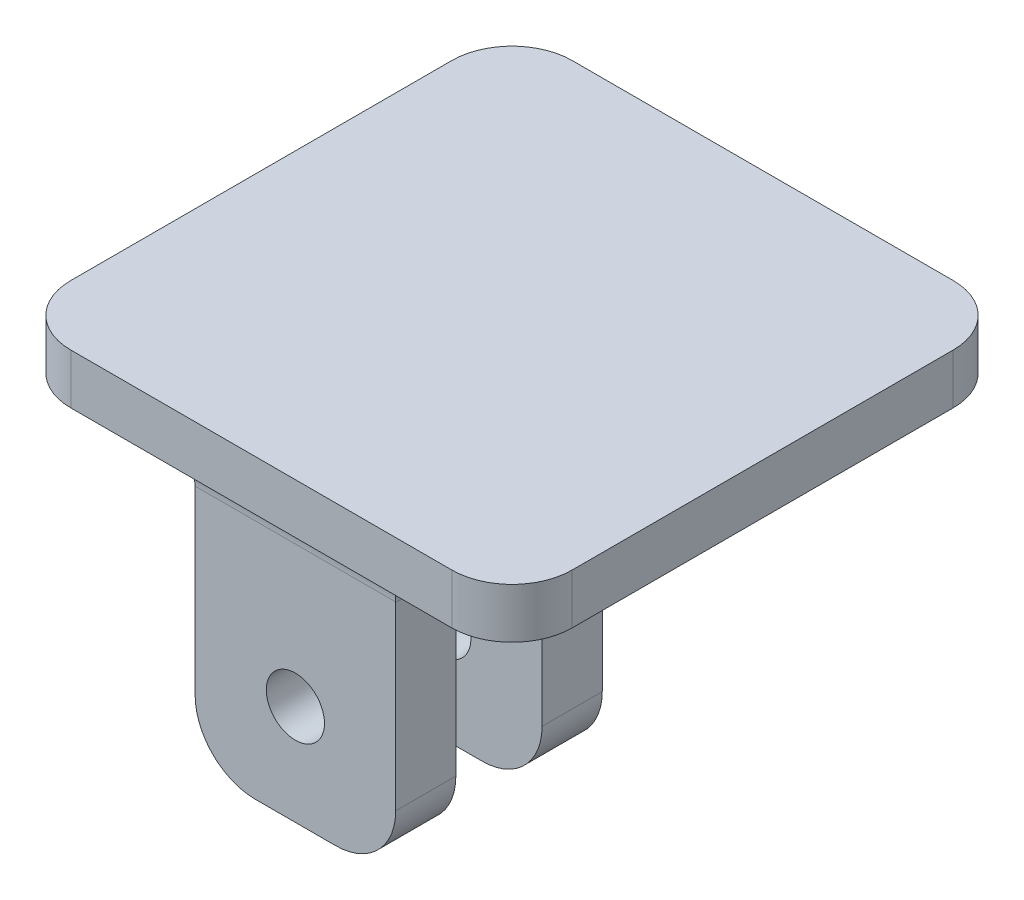
ISO-10303-21;
HEADER;
FILE_DESCRIPTION(('STEP AP214'),'2;1');
FILE_NAME('part.step','',(''),(''),'','','');
FILE_SCHEMA(('AUTOMOTIVE_DESIGN { 1 0 10303 214 1 1 1 1 }'));
ENDSEC;
DATA;
#1=APPLICATION_CONTEXT('core data for automotive mechanical design processes');
#2=APPLICATION_PROTOCOL_DEFINITION('international standard','automotive_design',2000,#1);
#3=PRODUCT_CONTEXT('',#1,'mechanical');
#4=PRODUCT('Part','Part','',(#3));
#5=PRODUCT_RELATED_PRODUCT_CATEGORY('part','',(#4));
#6=PRODUCT_DEFINITION_FORMATION('','',#4);
#7=PRODUCT_DEFINITION_CONTEXT('part definition',#1,'design');
#8=PRODUCT_DEFINITION('design','',#6,#7);
#9=PRODUCT_DEFINITION_SHAPE('','',#8);
#10=(LENGTH_UNIT() NAMED_UNIT(*) SI_UNIT(.MILLI.,.METRE.));
#11=(NAMED_UNIT(*) PLANE_ANGLE_UNIT() SI_UNIT($,.RADIAN.));
#12=(NAMED_UNIT(*) SI_UNIT($,.STERADIAN.) SOLID_ANGLE_UNIT());
#13=UNCERTAINTY_MEASURE_WITH_UNIT(LENGTH_MEASURE(1.E-05),#10,'distance_accuracy_value','');
#14=(GEOMETRIC_REPRESENTATION_CONTEXT(3) GLOBAL_UNCERTAINTY_ASSIGNED_CONTEXT((#13)) GLOBAL_UNIT_ASSIGNED_CONTEXT((#10,
#11,#12)) REPRESENTATION_CONTEXT('',''));
#15=CARTESIAN_POINT('',(0.,0.,0.));
#16=DIRECTION('',(0.,0.,1.));
#17=DIRECTION('',(1.,0.,0.));
#18=AXIS2_PLACEMENT_3D('',#15,#16,#17);
#19=CARTESIAN_POINT('',(-7.5,-14.,-1.7));
#20=DIRECTION('',(-1.,0.,0.));
#21=DIRECTION('',(0.,0.,1.));
#22=AXIS2_PLACEMENT_3D('',#19,#20,#21);
#23=PLANE('',#22);
#24=DIRECTION('',(0.,1.,0.));
#25=VECTOR('',#24,1.);
#26=CARTESIAN_POINT('',(-7.5,-14.,-12.));
#27=LINE('',#26,#25);
#28=CARTESIAN_POINT('',(-7.5,-11.,-12.));
#29=VERTEX_POINT('',#28);
#30=CARTESIAN_POINT('',(-7.5,-2.,-12.));
#31=VERTEX_POINT('',#30);
#32=EDGE_CURVE('E411',#29,#31,#27,.T.);
#33=ORIENTED_EDGE('',*,*,#32,.T.);
#34=DIRECTION('',(0.,0.,1.));
#35=VECTOR('',#34,1.);
#36=CARTESIAN_POINT('',(-7.5,-2.,-1.7));
#37=LINE('',#36,#35);
#38=CARTESIAN_POINT('',(-7.5,-2.,-9.));
#39=VERTEX_POINT('',#38);
#40=EDGE_CURVE('E256',#31,#39,#37,.T.);
#41=ORIENTED_EDGE('',*,*,#40,.T.);
#42=DIRECTION('',(0.,-1.,0.));
#43=VECTOR('',#42,1.);
#44=CARTESIAN_POINT('',(-7.5,-2.,-9.));
#45=LINE('',#44,#43);
#46=CARTESIAN_POINT('',(-7.5,-11.,-9.));
#47=VERTEX_POINT('',#46);
#48=EDGE_CURVE('E207',#39,#47,#45,.T.);
#49=ORIENTED_EDGE('',*,*,#48,.T.);
#50=DIRECTION('',(0.,0.,1.));
#51=VECTOR('',#50,1.);
#52=CARTESIAN_POINT('',(-7.5,-11.,-12.));
#53=LINE('',#52,#51);
#54=EDGE_CURVE('E461',#47,#29,#53,.F.);
#55=ORIENTED_EDGE('',*,*,#54,.T.);
#56=EDGE_LOOP('',(#33,#41,#49,#55));
#57=FACE_BOUND('',#56,.T.);
#58=ADVANCED_FACE('F33',(#57),#23,.F.);
#59=CARTESIAN_POINT('',(-17.5,-14.,-1.7));
#60=DIRECTION('',(1.,0.,0.));
#61=DIRECTION('',(0.,0.,-1.));
#62=AXIS2_PLACEMENT_3D('',#59,#60,#61);
#63=PLANE('',#62);
#64=DIRECTION('',(0.,1.,0.));
#65=VECTOR('',#64,1.);
#66=CARTESIAN_POINT('',(-17.5,-14.,-1.7));
#67=LINE('',#66,#65);
#68=CARTESIAN_POINT('',(-17.5,-11.,-1.7));
#69=VERTEX_POINT('',#68);
#70=CARTESIAN_POINT('',(-17.5,-2.,-1.7));
#71=VERTEX_POINT('',#70);
#72=EDGE_CURVE('E406',#69,#71,#67,.T.);
#73=ORIENTED_EDGE('',*,*,#72,.T.);
#74=DIRECTION('',(0.,0.,-1.));
#75=VECTOR('',#74,1.);
#76=CARTESIAN_POINT('',(-17.5,-2.,-12.));
#77=LINE('',#76,#75);
#78=CARTESIAN_POINT('',(-17.5,-2.,-4.7));
#79=VERTEX_POINT('',#78);
#80=EDGE_CURVE('E236',#71,#79,#77,.T.);
#81=ORIENTED_EDGE('',*,*,#80,.T.);
#82=DIRECTION('',(0.,-1.,0.));
#83=VECTOR('',#82,1.);
#84=CARTESIAN_POINT('',(-17.5,-2.,-4.7));
#85=LINE('',#84,#83);
#86=CARTESIAN_POINT('',(-17.5,-11.,-4.7));
#87=VERTEX_POINT('',#86);
#88=EDGE_CURVE('E393',#79,#87,#85,.T.);
#89=ORIENTED_EDGE('',*,*,#88,.T.);
#90=DIRECTION('',(0.,0.,-1.));
#91=VECTOR('',#90,1.);
#92=CARTESIAN_POINT('',(-17.5,-11.,-1.7));
#93=LINE('',#92,#91);
#94=EDGE_CURVE('E452',#87,#69,#93,.F.);
#95=ORIENTED_EDGE('',*,*,#94,.T.);
#96=EDGE_LOOP('',(#73,#81,#89,#95));
#97=FACE_BOUND('',#96,.T.);
#98=ADVANCED_FACE('F291',(#97),#63,.F.);
#99=CARTESIAN_POINT('',(0.,-14.,0.));
#100=DIRECTION('',(0.,-1.,0.));
#101=DIRECTION('',(0.,0.,-1.));
#102=AXIS2_PLACEMENT_3D('',#99,#100,#101);
#103=PLANE('',#102);
#104=DIRECTION('',(-1.,0.,0.));
#105=VECTOR('',#104,1.);
#106=CARTESIAN_POINT('',(-17.5,-14.,-4.7));
#107=LINE('',#106,#105);
#108=CARTESIAN_POINT('',(-10.5,-14.,-4.7));
#109=VERTEX_POINT('',#108);
#110=CARTESIAN_POINT('',(-14.5,-14.,-4.7));
#111=VERTEX_POINT('',#110);
#112=EDGE_CURVE('E221',#109,#111,#107,.T.);
#113=ORIENTED_EDGE('',*,*,#112,.F.);
#114=DIRECTION('',(0.,0.,1.));
#115=VECTOR('',#114,1.);
#116=CARTESIAN_POINT('',(-10.5,-14.,-1.7));
#117=LINE('',#116,#115);
#118=CARTESIAN_POINT('',(-10.5,-14.,-1.7));
#119=VERTEX_POINT('',#118);
#120=EDGE_CURVE('E466',#109,#119,#117,.T.);
#121=ORIENTED_EDGE('',*,*,#120,.T.);
#122=DIRECTION('',(-1.,0.,0.));
#123=VECTOR('',#122,1.);
#124=CARTESIAN_POINT('',(-17.5,-14.,-1.7));
#125=LINE('',#124,#123);
#126=CARTESIAN_POINT('',(-14.5,-14.,-1.7));
#127=VERTEX_POINT('',#126);
#128=EDGE_CURVE('E403',#119,#127,#125,.T.);
#129=ORIENTED_EDGE('',*,*,#128,.T.);
#130=DIRECTION('',(0.,0.,-1.));
#131=VECTOR('',#130,1.);
#132=CARTESIAN_POINT('',(-14.5,-14.,-4.7));
#133=LINE('',#132,#131);
#134=EDGE_CURVE('E463',#127,#111,#133,.T.);
#135=ORIENTED_EDGE('',*,*,#134,.T.);
#136=EDGE_LOOP('',(#113,#121,#129,#135));
#137=FACE_BOUND('',#136,.T.);
#138=ADVANCED_FACE('F300',(#137),#103,.T.);
#139=CARTESIAN_POINT('',(0.,0.,0.));
#140=DIRECTION('',(0.,1.,0.));
#141=DIRECTION('',(0.,0.,1.));
#142=AXIS2_PLACEMENT_3D('',#139,#140,#141);
#143=PLANE('',#142);
#144=DIRECTION('',(1.,0.,0.));
#145=VECTOR('',#144,1.);
#146=CARTESIAN_POINT('',(-17.5,0.,-14.));
#147=LINE('',#146,#145);
#148=CARTESIAN_POINT('',(-5.5,0.,-14.));
#149=VERTEX_POINT('',#148);
#150=CARTESIAN_POINT('',(-19.5,0.,-14.));
#151=VERTEX_POINT('',#150);
#152=EDGE_CURVE('E239',#149,#151,#147,.F.);
#153=ORIENTED_EDGE('',*,*,#152,.T.);
#154=DIRECTION('',(0.,0.,-1.));
#155=VECTOR('',#154,1.);
#156=CARTESIAN_POINT('',(-19.5,0.,-1.7));
#157=LINE('',#156,#155);
#158=CARTESIAN_POINT('',(-19.5,0.,0.));
#159=VERTEX_POINT('',#158);
#160=EDGE_CURVE('E249',#151,#159,#157,.F.);
#161=ORIENTED_EDGE('',*,*,#160,.T.);
#162=DIRECTION('',(1.,0.,0.));
#163=VECTOR('',#162,1.);
#164=CARTESIAN_POINT('',(0.,0.,0.));
#165=LINE('',#164,#163);
#166=CARTESIAN_POINT('',(-22.,0.,0.));
#167=VERTEX_POINT('',#166);
#168=EDGE_CURVE('E421',#167,#159,#165,.T.);
#169=ORIENTED_EDGE('',*,*,#168,.F.);
#170=CARTESIAN_POINT('',(-22.,0.,-3.));
#171=DIRECTION('',(0.,1.,0.));
#172=DIRECTION('',(0.,0.,1.));
#173=AXIS2_PLACEMENT_3D('',#170,#171,#172);
#174=CIRCLE('',#173,3.);
#175=CARTESIAN_POINT('',(-25.,0.,-3.));
#176=VERTEX_POINT('',#175);
#177=EDGE_CURVE('E486',#167,#176,#174,.F.);
#178=ORIENTED_EDGE('',*,*,#177,.T.);
#179=DIRECTION('',(0.,0.,1.));
#180=VECTOR('',#179,1.);
#181=CARTESIAN_POINT('',(-25.,0.,0.));
#182=LINE('',#181,#180);
#183=CARTESIAN_POINT('',(-25.,0.,-22.));
#184=VERTEX_POINT('',#183);
#185=EDGE_CURVE('E436',#184,#176,#182,.T.);
#186=ORIENTED_EDGE('',*,*,#185,.F.);
#187=CARTESIAN_POINT('',(-22.,0.,-22.));
#188=DIRECTION('',(0.,1.,0.));
#189=DIRECTION('',(0.,0.,1.));
#190=AXIS2_PLACEMENT_3D('',#187,#188,#189);
#191=CIRCLE('',#190,3.);
#192=CARTESIAN_POINT('',(-22.,0.,-25.));
#193=VERTEX_POINT('',#192);
#194=EDGE_CURVE('E482',#184,#193,#191,.F.);
#195=ORIENTED_EDGE('',*,*,#194,.T.);
#196=DIRECTION('',(-1.,0.,0.));
#197=VECTOR('',#196,1.);
#198=CARTESIAN_POINT('',(0.,0.,-25.));
#199=LINE('',#198,#197);
#200=CARTESIAN_POINT('',(-3.,0.,-25.));
#201=VERTEX_POINT('',#200);
#202=EDGE_CURVE('E433',#201,#193,#199,.T.);
#203=ORIENTED_EDGE('',*,*,#202,.F.);
#204=CARTESIAN_POINT('',(-3.,0.,-22.));
#205=DIRECTION('',(0.,1.,0.));
#206=DIRECTION('',(0.,0.,1.));
#207=AXIS2_PLACEMENT_3D('',#204,#205,#206);
#208=CIRCLE('',#207,3.);
#209=CARTESIAN_POINT('',(0.,0.,-22.));
#210=VERTEX_POINT('',#209);
#211=EDGE_CURVE('E484',#201,#210,#208,.F.);
#212=ORIENTED_EDGE('',*,*,#211,.T.);
#213=DIRECTION('',(0.,0.,-1.));
#214=VECTOR('',#213,1.);
#215=CARTESIAN_POINT('',(0.,0.,0.));
#216=LINE('',#215,#214);
#217=CARTESIAN_POINT('',(0.,0.,-3.));
#218=VERTEX_POINT('',#217);
#219=EDGE_CURVE('E416',#218,#210,#216,.T.);
#220=ORIENTED_EDGE('',*,*,#219,.F.);
#221=CARTESIAN_POINT('',(-3.,0.,-3.));
#222=DIRECTION('',(0.,1.,0.));
#223=DIRECTION('',(0.,0.,1.));
#224=AXIS2_PLACEMENT_3D('',#221,#222,#223);
#225=CIRCLE('',#224,3.);
#226=CARTESIAN_POINT('',(-3.,0.,0.));
#227=VERTEX_POINT('',#226);
#228=EDGE_CURVE('E488',#218,#227,#225,.F.);
#229=ORIENTED_EDGE('',*,*,#228,.T.);
#230=CARTESIAN_POINT('',(-5.5,0.,0.));
#231=VERTEX_POINT('',#230);
#232=EDGE_CURVE('E439',#231,#227,#165,.T.);
#233=ORIENTED_EDGE('',*,*,#232,.F.);
#234=DIRECTION('',(0.,0.,1.));
#235=VECTOR('',#234,1.);
#236=CARTESIAN_POINT('',(-5.5,0.,-12.));
#237=LINE('',#236,#235);
#238=EDGE_CURVE('E247',#231,#149,#237,.F.);
#239=ORIENTED_EDGE('',*,*,#238,.T.);
#240=EDGE_LOOP('',(#153,#161,#169,#178,#186,#195,#203,#212,#220,#229,#233,#239));
#241=FACE_BOUND('',#240,.T.);
#242=ADVANCED_FACE('F296',(#241),#143,.F.);
#243=CARTESIAN_POINT('',(0.,2.5,0.));
#244=DIRECTION('',(-1.,0.,0.));
#245=DIRECTION('',(0.,0.,1.));
#246=AXIS2_PLACEMENT_3D('',#243,#244,#245);
#247=PLANE('',#246);
#248=DIRECTION('',(0.,0.,-1.));
#249=VECTOR('',#248,1.);
#250=CARTESIAN_POINT('',(0.,2.5,0.));
#251=LINE('',#250,#249);
#252=CARTESIAN_POINT('',(0.,2.5,-3.));
#253=VERTEX_POINT('',#252);
#254=CARTESIAN_POINT('',(0.,2.5,-22.));
#255=VERTEX_POINT('',#254);
#256=EDGE_CURVE('E417',#253,#255,#251,.T.);
#257=ORIENTED_EDGE('',*,*,#256,.F.);
#258=DIRECTION('',(0.,-1.,0.));
#259=VECTOR('',#258,1.);
#260=CARTESIAN_POINT('',(0.,2.5,-3.));
#261=LINE('',#260,#259);
#262=EDGE_CURVE('E479',#253,#218,#261,.T.);
#263=ORIENTED_EDGE('',*,*,#262,.T.);
#264=ORIENTED_EDGE('',*,*,#219,.T.);
#265=DIRECTION('',(0.,-1.,0.));
#266=VECTOR('',#265,1.);
#267=CARTESIAN_POINT('',(0.,2.5,-22.));
#268=LINE('',#267,#266);
#269=EDGE_CURVE('E477',#210,#255,#268,.F.);
#270=ORIENTED_EDGE('',*,*,#269,.T.);
#271=EDGE_LOOP('',(#257,#263,#264,#270));
#272=FACE_BOUND('',#271,.T.);
#273=ADVANCED_FACE('F299',(#272),#247,.F.);
#274=CARTESIAN_POINT('',(0.,2.5,-25.));
#275=DIRECTION('',(0.,0.,1.));
#276=DIRECTION('',(1.,0.,0.));
#277=AXIS2_PLACEMENT_3D('',#274,#275,#276);
#278=PLANE('',#277);
#279=DIRECTION('',(-1.,0.,0.));
#280=VECTOR('',#279,1.);
#281=CARTESIAN_POINT('',(0.,2.5,-25.));
#282=LINE('',#281,#280);
#283=CARTESIAN_POINT('',(-3.,2.5,-25.));
#284=VERTEX_POINT('',#283);
#285=CARTESIAN_POINT('',(-22.,2.5,-25.));
#286=VERTEX_POINT('',#285);
#287=EDGE_CURVE('E420',#284,#286,#282,.T.);
#288=ORIENTED_EDGE('',*,*,#287,.F.);
#289=DIRECTION('',(0.,-1.,0.));
#290=VECTOR('',#289,1.);
#291=CARTESIAN_POINT('',(-3.,2.5,-25.));
#292=LINE('',#291,#290);
#293=EDGE_CURVE('E237',#284,#201,#292,.T.);
#294=ORIENTED_EDGE('',*,*,#293,.T.);
#295=ORIENTED_EDGE('',*,*,#202,.T.);
#296=DIRECTION('',(0.,-1.,0.));
#297=VECTOR('',#296,1.);
#298=CARTESIAN_POINT('',(-22.,2.5,-25.));
#299=LINE('',#298,#297);
#300=EDGE_CURVE('E242',#193,#286,#299,.F.);
#301=ORIENTED_EDGE('',*,*,#300,.T.);
#302=EDGE_LOOP('',(#288,#294,#295,#301));
#303=FACE_BOUND('',#302,.T.);
#304=ADVANCED_FACE('F308',(#303),#278,.F.);
#305=CARTESIAN_POINT('',(-25.,2.5,0.));
#306=DIRECTION('',(1.,0.,0.));
#307=DIRECTION('',(0.,0.,-1.));
#308=AXIS2_PLACEMENT_3D('',#305,#306,#307);
#309=PLANE('',#308);
#310=ORIENTED_EDGE('',*,*,#185,.T.);
#311=DIRECTION('',(0.,-1.,0.));
#312=VECTOR('',#311,1.);
#313=CARTESIAN_POINT('',(-25.,2.5,-3.));
#314=LINE('',#313,#312);
#315=CARTESIAN_POINT('',(-25.,2.5,-3.));
#316=VERTEX_POINT('',#315);
#317=EDGE_CURVE('E507',#176,#316,#314,.F.);
#318=ORIENTED_EDGE('',*,*,#317,.T.);
#319=DIRECTION('',(0.,0.,1.));
#320=VECTOR('',#319,1.);
#321=CARTESIAN_POINT('',(-25.,2.5,0.));
#322=LINE('',#321,#320);
#323=CARTESIAN_POINT('',(-25.,2.5,-22.));
#324=VERTEX_POINT('',#323);
#325=EDGE_CURVE('E424',#324,#316,#322,.T.);
#326=ORIENTED_EDGE('',*,*,#325,.F.);
#327=DIRECTION('',(0.,-1.,0.));
#328=VECTOR('',#327,1.);
#329=CARTESIAN_POINT('',(-25.,2.5,-22.));
#330=LINE('',#329,#328);
#331=EDGE_CURVE('E504',#324,#184,#330,.T.);
#332=ORIENTED_EDGE('',*,*,#331,.T.);
#333=EDGE_LOOP('',(#310,#318,#326,#332));
#334=FACE_BOUND('',#333,.T.);
#335=ADVANCED_FACE('F304',(#334),#309,.F.);
#336=CARTESIAN_POINT('',(0.,2.5,0.));
#337=DIRECTION('',(0.,0.,-1.));
#338=DIRECTION('',(-1.,0.,0.));
#339=AXIS2_PLACEMENT_3D('',#336,#337,#338);
#340=PLANE('',#339);
#341=ORIENTED_EDGE('',*,*,#168,.T.);
#342=EDGE_CURVE('E441',#159,#231,#165,.T.);
#343=ORIENTED_EDGE('',*,*,#342,.T.);
#344=ORIENTED_EDGE('',*,*,#232,.T.);
#345=DIRECTION('',(0.,-1.,0.));
#346=VECTOR('',#345,1.);
#347=CARTESIAN_POINT('',(-3.,2.5,0.));
#348=LINE('',#347,#346);
#349=CARTESIAN_POINT('',(-3.,2.5,0.));
#350=VERTEX_POINT('',#349);
#351=EDGE_CURVE('E494',#227,#350,#348,.F.);
#352=ORIENTED_EDGE('',*,*,#351,.T.);
#353=DIRECTION('',(1.,0.,0.));
#354=VECTOR('',#353,1.);
#355=CARTESIAN_POINT('',(0.,2.5,0.));
#356=LINE('',#355,#354);
#357=CARTESIAN_POINT('',(-22.,2.5,0.));
#358=VERTEX_POINT('',#357);
#359=EDGE_CURVE('E427',#358,#350,#356,.T.);
#360=ORIENTED_EDGE('',*,*,#359,.F.);
#361=DIRECTION('',(0.,-1.,0.));
#362=VECTOR('',#361,1.);
#363=CARTESIAN_POINT('',(-22.,2.5,0.));
#364=LINE('',#363,#362);
#365=EDGE_CURVE('E491',#358,#167,#364,.T.);
#366=ORIENTED_EDGE('',*,*,#365,.T.);
#367=EDGE_LOOP('',(#341,#343,#344,#352,#360,#366));
#368=FACE_BOUND('',#367,.T.);
#369=ADVANCED_FACE('F294',(#368),#340,.F.);
#370=CARTESIAN_POINT('',(0.,2.5,0.));
#371=DIRECTION('',(0.,1.,0.));
#372=DIRECTION('',(0.,0.,1.));
#373=AXIS2_PLACEMENT_3D('',#370,#371,#372);
#374=PLANE('',#373);
#375=ORIENTED_EDGE('',*,*,#359,.T.);
#376=CARTESIAN_POINT('',(-3.,2.5,-3.));
#377=DIRECTION('',(0.,1.,0.));
#378=DIRECTION('',(0.,0.,1.));
#379=AXIS2_PLACEMENT_3D('',#376,#377,#378);
#380=CIRCLE('',#379,3.);
#381=EDGE_CURVE('E502',#350,#253,#380,.T.);
#382=ORIENTED_EDGE('',*,*,#381,.T.);
#383=ORIENTED_EDGE('',*,*,#256,.T.);
#384=CARTESIAN_POINT('',(-3.,2.5,-22.));
#385=DIRECTION('',(0.,1.,0.));
#386=DIRECTION('',(0.,0.,1.));
#387=AXIS2_PLACEMENT_3D('',#384,#385,#386);
#388=CIRCLE('',#387,3.);
#389=EDGE_CURVE('E498',#255,#284,#388,.T.);
#390=ORIENTED_EDGE('',*,*,#389,.T.);
#391=ORIENTED_EDGE('',*,*,#287,.T.);
#392=CARTESIAN_POINT('',(-22.,2.5,-22.));
#393=DIRECTION('',(0.,1.,0.));
#394=DIRECTION('',(0.,0.,1.));
#395=AXIS2_PLACEMENT_3D('',#392,#393,#394);
#396=CIRCLE('',#395,3.);
#397=EDGE_CURVE('E496',#286,#324,#396,.T.);
#398=ORIENTED_EDGE('',*,*,#397,.T.);
#399=ORIENTED_EDGE('',*,*,#325,.T.);
#400=CARTESIAN_POINT('',(-22.,2.5,-3.));
#401=DIRECTION('',(0.,1.,0.));
#402=DIRECTION('',(0.,0.,1.));
#403=AXIS2_PLACEMENT_3D('',#400,#401,#402);
#404=CIRCLE('',#403,3.);
#405=EDGE_CURVE('E500',#316,#358,#404,.T.);
#406=ORIENTED_EDGE('',*,*,#405,.T.);
#407=EDGE_LOOP('',(#375,#382,#383,#390,#391,#398,#399,#406));
#408=FACE_BOUND('',#407,.T.);
#409=ADVANCED_FACE('F290',(#408),#374,.T.);
#410=DIRECTION('',(0.,-1.,0.));
#411=VECTOR('',#410,1.);
#412=CARTESIAN_POINT('',(-17.5,-2.,-9.));
#413=LINE('',#412,#411);
#414=CARTESIAN_POINT('',(-17.5,-2.,-9.));
#415=VERTEX_POINT('',#414);
#416=CARTESIAN_POINT('',(-17.5,-11.,-9.));
#417=VERTEX_POINT('',#416);
#418=EDGE_CURVE('E204',#415,#417,#413,.T.);
#419=ORIENTED_EDGE('',*,*,#418,.F.);
#420=DIRECTION('',(0.,0.,-1.));
#421=VECTOR('',#420,1.);
#422=CARTESIAN_POINT('',(-17.5,-2.,-12.));
#423=LINE('',#422,#421);
#424=CARTESIAN_POINT('',(-17.5,-2.,-12.));
#425=VERTEX_POINT('',#424);
#426=EDGE_CURVE('E226',#415,#425,#423,.T.);
#427=ORIENTED_EDGE('',*,*,#426,.T.);
#428=DIRECTION('',(0.,1.,0.));
#429=VECTOR('',#428,1.);
#430=CARTESIAN_POINT('',(-17.5,-14.,-12.));
#431=LINE('',#430,#429);
#432=CARTESIAN_POINT('',(-17.5,-11.,-12.));
#433=VERTEX_POINT('',#432);
#434=EDGE_CURVE('E414',#433,#425,#431,.T.);
#435=ORIENTED_EDGE('',*,*,#434,.F.);
#436=DIRECTION('',(0.,0.,-1.));
#437=VECTOR('',#436,1.);
#438=CARTESIAN_POINT('',(-17.5,-11.,-9.));
#439=LINE('',#438,#437);
#440=EDGE_CURVE('E229',#433,#417,#439,.F.);
#441=ORIENTED_EDGE('',*,*,#440,.T.);
#442=EDGE_LOOP('',(#419,#427,#435,#441));
#443=FACE_BOUND('',#442,.T.);
#444=ADVANCED_FACE('F224',(#443),#63,.F.);
#445=CARTESIAN_POINT('',(-17.5,-14.,-12.));
#446=DIRECTION('',(0.,0.,1.));
#447=DIRECTION('',(1.,0.,0.));
#448=AXIS2_PLACEMENT_3D('',#445,#446,#447);
#449=PLANE('',#448);
#450=CARTESIAN_POINT('',(-12.5,-9.,-12.));
#451=DIRECTION('',(0.,0.,1.));
#452=DIRECTION('',(1.,0.,0.));
#453=AXIS2_PLACEMENT_3D('',#450,#451,#452);
#454=CIRCLE('',#453,1.45);
#455=CARTESIAN_POINT('',(-11.05,-9.,-12.));
#456=VERTEX_POINT('',#455);
#457=EDGE_CURVE('E383',#456,#456,#454,.T.);
#458=ORIENTED_EDGE('',*,*,#457,.T.);
#459=EDGE_LOOP('',(#458));
#460=FACE_BOUND('',#459,.T.);
#461=ORIENTED_EDGE('',*,*,#434,.T.);
#462=DIRECTION('',(1.,0.,0.));
#463=VECTOR('',#462,1.);
#464=CARTESIAN_POINT('',(-7.5,-2.,-12.));
#465=LINE('',#464,#463);
#466=EDGE_CURVE('E258',#425,#31,#465,.T.);
#467=ORIENTED_EDGE('',*,*,#466,.T.);
#468=ORIENTED_EDGE('',*,*,#32,.F.);
#469=CARTESIAN_POINT('',(-10.5,-11.,-12.));
#470=DIRECTION('',(0.,0.,1.));
#471=DIRECTION('',(1.,0.,0.));
#472=AXIS2_PLACEMENT_3D('',#469,#470,#471);
#473=CIRCLE('',#472,3.);
#474=CARTESIAN_POINT('',(-10.5,-14.,-12.));
#475=VERTEX_POINT('',#474);
#476=EDGE_CURVE('E448',#29,#475,#473,.F.);
#477=ORIENTED_EDGE('',*,*,#476,.T.);
#478=DIRECTION('',(1.,0.,0.));
#479=VECTOR('',#478,1.);
#480=CARTESIAN_POINT('',(-17.5,-14.,-12.));
#481=LINE('',#480,#479);
#482=CARTESIAN_POINT('',(-14.5,-14.,-12.));
#483=VERTEX_POINT('',#482);
#484=EDGE_CURVE('E396',#483,#475,#481,.T.);
#485=ORIENTED_EDGE('',*,*,#484,.F.);
#486=CARTESIAN_POINT('',(-14.5,-11.,-12.));
#487=DIRECTION('',(0.,0.,1.));
#488=DIRECTION('',(1.,0.,0.));
#489=AXIS2_PLACEMENT_3D('',#486,#487,#488);
#490=CIRCLE('',#489,3.);
#491=EDGE_CURVE('E450',#483,#433,#490,.F.);
#492=ORIENTED_EDGE('',*,*,#491,.T.);
#493=EDGE_LOOP('',(#461,#467,#468,#477,#485,#492));
#494=FACE_BOUND('',#493,.T.);
#495=ADVANCED_FACE('F283',(#460,#494),#449,.F.);
#496=DIRECTION('',(0.,-1.,0.));
#497=VECTOR('',#496,1.);
#498=CARTESIAN_POINT('',(-7.5,-2.,-4.7));
#499=LINE('',#498,#497);
#500=CARTESIAN_POINT('',(-7.5,-2.,-4.7));
#501=VERTEX_POINT('',#500);
#502=CARTESIAN_POINT('',(-7.5,-11.,-4.7));
#503=VERTEX_POINT('',#502);
#504=EDGE_CURVE('E397',#501,#503,#499,.T.);
#505=ORIENTED_EDGE('',*,*,#504,.F.);
#506=DIRECTION('',(0.,0.,1.));
#507=VECTOR('',#506,1.);
#508=CARTESIAN_POINT('',(-7.5,-2.,-1.7));
#509=LINE('',#508,#507);
#510=CARTESIAN_POINT('',(-7.5,-2.,-1.7));
#511=VERTEX_POINT('',#510);
#512=EDGE_CURVE('E254',#501,#511,#509,.T.);
#513=ORIENTED_EDGE('',*,*,#512,.T.);
#514=DIRECTION('',(0.,1.,0.));
#515=VECTOR('',#514,1.);
#516=CARTESIAN_POINT('',(-7.5,-14.,-1.7));
#517=LINE('',#516,#515);
#518=CARTESIAN_POINT('',(-7.5,-11.,-1.7));
#519=VERTEX_POINT('',#518);
#520=EDGE_CURVE('E409',#519,#511,#517,.T.);
#521=ORIENTED_EDGE('',*,*,#520,.F.);
#522=DIRECTION('',(0.,0.,1.));
#523=VECTOR('',#522,1.);
#524=CARTESIAN_POINT('',(-7.5,-11.,-4.7));
#525=LINE('',#524,#523);
#526=EDGE_CURVE('E459',#519,#503,#525,.F.);
#527=ORIENTED_EDGE('',*,*,#526,.T.);
#528=EDGE_LOOP('',(#505,#513,#521,#527));
#529=FACE_BOUND('',#528,.T.);
#530=ADVANCED_FACE('F277',(#529),#23,.F.);
#531=CARTESIAN_POINT('',(-17.5,-14.,-1.7));
#532=DIRECTION('',(0.,0.,-1.));
#533=DIRECTION('',(-1.,0.,0.));
#534=AXIS2_PLACEMENT_3D('',#531,#532,#533);
#535=PLANE('',#534);
#536=CARTESIAN_POINT('',(-12.5,-9.,-1.7));
#537=DIRECTION('',(0.,0.,1.));
#538=DIRECTION('',(1.,0.,0.));
#539=AXIS2_PLACEMENT_3D('',#536,#537,#538);
#540=CIRCLE('',#539,1.45);
#541=CARTESIAN_POINT('',(-11.05,-9.,-1.7));
#542=VERTEX_POINT('',#541);
#543=EDGE_CURVE('E369',#542,#542,#540,.T.);
#544=ORIENTED_EDGE('',*,*,#543,.F.);
#545=EDGE_LOOP('',(#544));
#546=FACE_BOUND('',#545,.T.);
#547=ORIENTED_EDGE('',*,*,#520,.T.);
#548=CARTESIAN_POINT('',(-5.5,-2.,-1.7));
#549=DIRECTION('',(0.,0.,-1.));
#550=DIRECTION('',(-1.,0.,0.));
#551=AXIS2_PLACEMENT_3D('',#548,#549,#550);
#552=CIRCLE('',#551,2.);
#553=CARTESIAN_POINT('',(-7.49987198923183,-1.97737199332852,-1.7));
#554=VERTEX_POINT('',#553);
#555=EDGE_CURVE('E11',#511,#554,#552,.T.);
#556=ORIENTED_EDGE('',*,*,#555,.T.);
#557=CARTESIAN_POINT('',(-7.49987198923183,-1.97737199332852,-1.7));
#558=CARTESIAN_POINT('',(-7.5,-1.97737199332852,-1.7));
#559=B_SPLINE_CURVE_WITH_KNOTS('',1,(#557,#558),.UNSPECIFIED.,.F.,.F.,(2,2),(0.,1.),.UNSPECIFIED.);
#560=CARTESIAN_POINT('',(-7.5,-1.97737199332852,-1.7));
#561=VERTEX_POINT('',#560);
#562=EDGE_CURVE('E47',#554,#561,#559,.T.);
#563=ORIENTED_EDGE('',*,*,#562,.T.);
#564=DIRECTION('',(-1.,0.,0.));
#565=VECTOR('',#564,1.);
#566=CARTESIAN_POINT('',(-17.5,-1.97737199332852,-1.7));
#567=LINE('',#566,#565);
#568=CARTESIAN_POINT('',(-17.5,-1.97737199332852,-1.7));
#569=VERTEX_POINT('',#568);
#570=EDGE_CURVE('E252',#561,#569,#567,.T.);
#571=ORIENTED_EDGE('',*,*,#570,.T.);
#572=CARTESIAN_POINT('',(-17.5,-1.97737199332852,-1.7));
#573=CARTESIAN_POINT('',(-17.5001280107682,-1.97737199332852,-1.7));
#574=B_SPLINE_CURVE_WITH_KNOTS('',1,(#572,#573),.UNSPECIFIED.,.F.,.F.,(2,2),(0.,1.),.UNSPECIFIED.);
#575=CARTESIAN_POINT('',(-17.5001280107682,-1.97737199332852,-1.7));
#576=VERTEX_POINT('',#575);
#577=EDGE_CURVE('E60',#569,#576,#574,.T.);
#578=ORIENTED_EDGE('',*,*,#577,.T.);
#579=CARTESIAN_POINT('',(-19.5,-2.,-1.7));
#580=DIRECTION('',(0.,0.,-1.));
#581=DIRECTION('',(-1.,0.,0.));
#582=AXIS2_PLACEMENT_3D('',#579,#580,#581);
#583=CIRCLE('',#582,2.);
#584=EDGE_CURVE('E260',#576,#71,#583,.T.);
#585=ORIENTED_EDGE('',*,*,#584,.T.);
#586=ORIENTED_EDGE('',*,*,#72,.F.);
#587=CARTESIAN_POINT('',(-14.5,-11.,-1.7));
#588=DIRECTION('',(0.,0.,-1.));
#589=DIRECTION('',(-1.,0.,0.));
#590=AXIS2_PLACEMENT_3D('',#587,#588,#589);
#591=CIRCLE('',#590,3.);
#592=EDGE_CURVE('E469',#69,#127,#591,.F.);
#593=ORIENTED_EDGE('',*,*,#592,.T.);
#594=ORIENTED_EDGE('',*,*,#128,.F.);
#595=CARTESIAN_POINT('',(-10.5,-11.,-1.7));
#596=DIRECTION('',(0.,0.,-1.));
#597=DIRECTION('',(-1.,0.,0.));
#598=AXIS2_PLACEMENT_3D('',#595,#596,#597);
#599=CIRCLE('',#598,3.);
#600=EDGE_CURVE('E471',#119,#519,#599,.F.);
#601=ORIENTED_EDGE('',*,*,#600,.T.);
#602=EDGE_LOOP('',(#547,#556,#563,#571,#578,#585,#586,#593,#594,#601));
#603=FACE_BOUND('',#602,.T.);
#604=ADVANCED_FACE('F266',(#546,#603),#535,.F.);
#605=DIRECTION('',(1.,0.,0.));
#606=VECTOR('',#605,1.);
#607=CARTESIAN_POINT('',(-17.5,-14.,-9.));
#608=LINE('',#607,#606);
#609=CARTESIAN_POINT('',(-14.5,-14.,-9.));
#610=VERTEX_POINT('',#609);
#611=CARTESIAN_POINT('',(-10.5,-14.,-9.));
#612=VERTEX_POINT('',#611);
#613=EDGE_CURVE('E385',#610,#612,#608,.T.);
#614=ORIENTED_EDGE('',*,*,#613,.F.);
#615=DIRECTION('',(0.,0.,-1.));
#616=VECTOR('',#615,1.);
#617=CARTESIAN_POINT('',(-14.5,-14.,-12.));
#618=LINE('',#617,#616);
#619=EDGE_CURVE('E445',#610,#483,#618,.T.);
#620=ORIENTED_EDGE('',*,*,#619,.T.);
#621=ORIENTED_EDGE('',*,*,#484,.T.);
#622=DIRECTION('',(0.,0.,1.));
#623=VECTOR('',#622,1.);
#624=CARTESIAN_POINT('',(-10.5,-14.,-9.));
#625=LINE('',#624,#623);
#626=EDGE_CURVE('E430',#475,#612,#625,.T.);
#627=ORIENTED_EDGE('',*,*,#626,.T.);
#628=EDGE_LOOP('',(#614,#620,#621,#627));
#629=FACE_BOUND('',#628,.T.);
#630=ADVANCED_FACE('F276',(#629),#103,.T.);
#631=CARTESIAN_POINT('',(-17.5,-2.,-4.7));
#632=DIRECTION('',(0.,0.,1.));
#633=DIRECTION('',(1.,0.,0.));
#634=AXIS2_PLACEMENT_3D('',#631,#632,#633);
#635=PLANE('',#634);
#636=CARTESIAN_POINT('',(-12.5,-9.,-4.7));
#637=DIRECTION('',(0.,0.,1.));
#638=DIRECTION('',(1.,0.,0.));
#639=AXIS2_PLACEMENT_3D('',#636,#637,#638);
#640=CIRCLE('',#639,1.45);
#641=CARTESIAN_POINT('',(-11.05,-9.,-4.7));
#642=VERTEX_POINT('',#641);
#643=EDGE_CURVE('E378',#642,#642,#640,.T.);
#644=ORIENTED_EDGE('',*,*,#643,.T.);
#645=EDGE_LOOP('',(#644));
#646=FACE_BOUND('',#645,.T.);
#647=ORIENTED_EDGE('',*,*,#504,.T.);
#648=CARTESIAN_POINT('',(-10.5,-11.,-4.7));
#649=DIRECTION('',(0.,0.,1.));
#650=DIRECTION('',(1.,0.,0.));
#651=AXIS2_PLACEMENT_3D('',#648,#649,#650);
#652=CIRCLE('',#651,3.);
#653=EDGE_CURVE('E475',#503,#109,#652,.F.);
#654=ORIENTED_EDGE('',*,*,#653,.T.);
#655=ORIENTED_EDGE('',*,*,#112,.T.);
#656=CARTESIAN_POINT('',(-14.5,-11.,-4.7));
#657=DIRECTION('',(0.,0.,1.));
#658=DIRECTION('',(1.,0.,0.));
#659=AXIS2_PLACEMENT_3D('',#656,#657,#658);
#660=CIRCLE('',#659,3.);
#661=EDGE_CURVE('E473',#111,#87,#660,.F.);
#662=ORIENTED_EDGE('',*,*,#661,.T.);
#663=ORIENTED_EDGE('',*,*,#88,.F.);
#664=DIRECTION('',(-1.,0.,0.));
#665=VECTOR('',#664,1.);
#666=CARTESIAN_POINT('',(-17.5,-2.,-4.7));
#667=LINE('',#666,#665);
#668=EDGE_CURVE('E216',#501,#79,#667,.T.);
#669=ORIENTED_EDGE('',*,*,#668,.F.);
#670=EDGE_LOOP('',(#647,#654,#655,#662,#663,#669));
#671=FACE_BOUND('',#670,.T.);
#672=ADVANCED_FACE('F541',(#646,#671),#635,.F.);
#673=CARTESIAN_POINT('',(-17.5,-2.,-9.));
#674=DIRECTION('',(0.,0.,-1.));
#675=DIRECTION('',(-1.,0.,0.));
#676=AXIS2_PLACEMENT_3D('',#673,#674,#675);
#677=PLANE('',#676);
#678=CARTESIAN_POINT('',(-12.5,-9.,-9.));
#679=DIRECTION('',(0.,0.,-1.));
#680=DIRECTION('',(-1.,0.,0.));
#681=AXIS2_PLACEMENT_3D('',#678,#679,#680);
#682=CIRCLE('',#681,1.45);
#683=CARTESIAN_POINT('',(-13.95,-9.,-9.));
#684=VERTEX_POINT('',#683);
#685=EDGE_CURVE('E373',#684,#684,#682,.T.);
#686=ORIENTED_EDGE('',*,*,#685,.T.);
#687=EDGE_LOOP('',(#686));
#688=FACE_BOUND('',#687,.T.);
#689=ORIENTED_EDGE('',*,*,#418,.T.);
#690=CARTESIAN_POINT('',(-14.5,-11.,-9.));
#691=DIRECTION('',(0.,0.,-1.));
#692=DIRECTION('',(-1.,0.,0.));
#693=AXIS2_PLACEMENT_3D('',#690,#691,#692);
#694=CIRCLE('',#693,3.);
#695=EDGE_CURVE('E457',#417,#610,#694,.F.);
#696=ORIENTED_EDGE('',*,*,#695,.T.);
#697=ORIENTED_EDGE('',*,*,#613,.T.);
#698=CARTESIAN_POINT('',(-10.5,-11.,-9.));
#699=DIRECTION('',(0.,0.,-1.));
#700=DIRECTION('',(-1.,0.,0.));
#701=AXIS2_PLACEMENT_3D('',#698,#699,#700);
#702=CIRCLE('',#701,3.);
#703=EDGE_CURVE('E455',#612,#47,#702,.F.);
#704=ORIENTED_EDGE('',*,*,#703,.T.);
#705=ORIENTED_EDGE('',*,*,#48,.F.);
#706=DIRECTION('',(1.,0.,0.));
#707=VECTOR('',#706,1.);
#708=CARTESIAN_POINT('',(-17.5,-2.,-9.));
#709=LINE('',#708,#707);
#710=EDGE_CURVE('E200',#415,#39,#709,.T.);
#711=ORIENTED_EDGE('',*,*,#710,.F.);
#712=EDGE_LOOP('',(#689,#696,#697,#704,#705,#711));
#713=FACE_BOUND('',#712,.T.);
#714=ADVANCED_FACE('F202',(#688,#713),#677,.F.);
#715=CARTESIAN_POINT('',(0.,-2.,0.));
#716=DIRECTION('',(0.,-1.,0.));
#717=DIRECTION('',(0.,0.,-1.));
#718=AXIS2_PLACEMENT_3D('',#715,#716,#717);
#719=PLANE('',#718);
#720=DIRECTION('',(0.,0.,-1.));
#721=VECTOR('',#720,1.);
#722=CARTESIAN_POINT('',(-17.5,-2.,-4.7));
#723=LINE('',#722,#721);
#724=EDGE_CURVE('E211',#79,#415,#723,.T.);
#725=ORIENTED_EDGE('',*,*,#724,.T.);
#726=ORIENTED_EDGE('',*,*,#710,.T.);
#727=DIRECTION('',(0.,0.,1.));
#728=VECTOR('',#727,1.);
#729=CARTESIAN_POINT('',(-7.5,-2.,-4.7));
#730=LINE('',#729,#728);
#731=EDGE_CURVE('E210',#39,#501,#730,.T.);
#732=ORIENTED_EDGE('',*,*,#731,.T.);
#733=ORIENTED_EDGE('',*,*,#668,.T.);
#734=EDGE_LOOP('',(#725,#726,#732,#733));
#735=FACE_BOUND('',#734,.T.);
#736=ADVANCED_FACE('F214',(#735),#719,.T.);
#737=CARTESIAN_POINT('',(-12.5,-9.,-25.));
#738=DIRECTION('',(0.,0.,1.));
#739=DIRECTION('',(1.,0.,0.));
#740=AXIS2_PLACEMENT_3D('',#737,#738,#739);
#741=CYLINDRICAL_SURFACE('',#740,1.45);
#742=ORIENTED_EDGE('',*,*,#685,.F.);
#743=EDGE_LOOP('',(#742));
#744=FACE_BOUND('',#743,.T.);
#745=ORIENTED_EDGE('',*,*,#457,.F.);
#746=EDGE_LOOP('',(#745));
#747=FACE_BOUND('',#746,.T.);
#748=ADVANCED_FACE('F581',(#744,#747),#741,.F.);
#749=ORIENTED_EDGE('',*,*,#543,.T.);
#750=EDGE_LOOP('',(#749));
#751=FACE_BOUND('',#750,.T.);
#752=ORIENTED_EDGE('',*,*,#643,.F.);
#753=EDGE_LOOP('',(#752));
#754=FACE_BOUND('',#753,.T.);
#755=ADVANCED_FACE('F320',(#751,#754),#741,.F.);
#756=CARTESIAN_POINT('',(-14.5,-11.,0.));
#757=DIRECTION('',(0.,0.,1.));
#758=DIRECTION('',(1.,0.,0.));
#759=AXIS2_PLACEMENT_3D('',#756,#757,#758);
#760=CYLINDRICAL_SURFACE('',#759,3.);
#761=ORIENTED_EDGE('',*,*,#695,.F.);
#762=ORIENTED_EDGE('',*,*,#440,.F.);
#763=ORIENTED_EDGE('',*,*,#491,.F.);
#764=ORIENTED_EDGE('',*,*,#619,.F.);
#765=EDGE_LOOP('',(#761,#762,#763,#764));
#766=FACE_BOUND('',#765,.T.);
#767=ADVANCED_FACE('F316',(#766),#760,.T.);
#768=CARTESIAN_POINT('',(-10.5,-11.,0.));
#769=DIRECTION('',(0.,0.,-1.));
#770=DIRECTION('',(-1.,0.,0.));
#771=AXIS2_PLACEMENT_3D('',#768,#769,#770);
#772=CYLINDRICAL_SURFACE('',#771,3.);
#773=ORIENTED_EDGE('',*,*,#476,.F.);
#774=ORIENTED_EDGE('',*,*,#54,.F.);
#775=ORIENTED_EDGE('',*,*,#703,.F.);
#776=ORIENTED_EDGE('',*,*,#626,.F.);
#777=EDGE_LOOP('',(#773,#774,#775,#776));
#778=FACE_BOUND('',#777,.T.);
#779=ADVANCED_FACE('F319',(#778),#772,.T.);
#780=CARTESIAN_POINT('',(-10.5,-11.,0.));
#781=DIRECTION('',(0.,0.,-1.));
#782=DIRECTION('',(-1.,0.,0.));
#783=AXIS2_PLACEMENT_3D('',#780,#781,#782);
#784=CYLINDRICAL_SURFACE('',#783,3.);
#785=ORIENTED_EDGE('',*,*,#653,.F.);
#786=ORIENTED_EDGE('',*,*,#526,.F.);
#787=ORIENTED_EDGE('',*,*,#600,.F.);
#788=ORIENTED_EDGE('',*,*,#120,.F.);
#789=EDGE_LOOP('',(#785,#786,#787,#788));
#790=FACE_BOUND('',#789,.T.);
#791=ADVANCED_FACE('F324',(#790),#784,.T.);
#792=CARTESIAN_POINT('',(-14.5,-11.,0.));
#793=DIRECTION('',(0.,0.,1.));
#794=DIRECTION('',(1.,0.,0.));
#795=AXIS2_PLACEMENT_3D('',#792,#793,#794);
#796=CYLINDRICAL_SURFACE('',#795,3.);
#797=ORIENTED_EDGE('',*,*,#592,.F.);
#798=ORIENTED_EDGE('',*,*,#94,.F.);
#799=ORIENTED_EDGE('',*,*,#661,.F.);
#800=ORIENTED_EDGE('',*,*,#134,.F.);
#801=EDGE_LOOP('',(#797,#798,#799,#800));
#802=FACE_BOUND('',#801,.T.);
#803=ADVANCED_FACE('F328',(#802),#796,.T.);
#804=CARTESIAN_POINT('',(-3.,2.5,-3.));
#805=DIRECTION('',(0.,-1.,0.));
#806=DIRECTION('',(0.,0.,-1.));
#807=AXIS2_PLACEMENT_3D('',#804,#805,#806);
#808=CYLINDRICAL_SURFACE('',#807,3.);
#809=ORIENTED_EDGE('',*,*,#381,.F.);
#810=ORIENTED_EDGE('',*,*,#351,.F.);
#811=ORIENTED_EDGE('',*,*,#228,.F.);
#812=ORIENTED_EDGE('',*,*,#262,.F.);
#813=EDGE_LOOP('',(#809,#810,#811,#812));
#814=FACE_BOUND('',#813,.T.);
#815=ADVANCED_FACE('F332',(#814),#808,.T.);
#816=CARTESIAN_POINT('',(-22.,2.5,-3.));
#817=DIRECTION('',(0.,-1.,0.));
#818=DIRECTION('',(0.,0.,-1.));
#819=AXIS2_PLACEMENT_3D('',#816,#817,#818);
#820=CYLINDRICAL_SURFACE('',#819,3.);
#821=ORIENTED_EDGE('',*,*,#405,.F.);
#822=ORIENTED_EDGE('',*,*,#317,.F.);
#823=ORIENTED_EDGE('',*,*,#177,.F.);
#824=ORIENTED_EDGE('',*,*,#365,.F.);
#825=EDGE_LOOP('',(#821,#822,#823,#824));
#826=FACE_BOUND('',#825,.T.);
#827=ADVANCED_FACE('F336',(#826),#820,.T.);
#828=CARTESIAN_POINT('',(-3.,2.5,-22.));
#829=DIRECTION('',(0.,-1.,0.));
#830=DIRECTION('',(0.,0.,-1.));
#831=AXIS2_PLACEMENT_3D('',#828,#829,#830);
#832=CYLINDRICAL_SURFACE('',#831,3.);
#833=ORIENTED_EDGE('',*,*,#389,.F.);
#834=ORIENTED_EDGE('',*,*,#269,.F.);
#835=ORIENTED_EDGE('',*,*,#211,.F.);
#836=ORIENTED_EDGE('',*,*,#293,.F.);
#837=EDGE_LOOP('',(#833,#834,#835,#836));
#838=FACE_BOUND('',#837,.T.);
#839=ADVANCED_FACE('F340',(#838),#832,.T.);
#840=CARTESIAN_POINT('',(-22.,2.5,-22.));
#841=DIRECTION('',(0.,-1.,0.));
#842=DIRECTION('',(0.,0.,-1.));
#843=AXIS2_PLACEMENT_3D('',#840,#841,#842);
#844=CYLINDRICAL_SURFACE('',#843,3.);
#845=ORIENTED_EDGE('',*,*,#397,.F.);
#846=ORIENTED_EDGE('',*,*,#300,.F.);
#847=ORIENTED_EDGE('',*,*,#194,.F.);
#848=ORIENTED_EDGE('',*,*,#331,.F.);
#849=EDGE_LOOP('',(#845,#846,#847,#848));
#850=FACE_BOUND('',#849,.T.);
#851=ADVANCED_FACE('F344',(#850),#844,.T.);
#852=CARTESIAN_POINT('',(-5.5,-2.,-1.7));
#853=DIRECTION('',(0.,0.,-1.));
#854=DIRECTION('',(-1.,0.,0.));
#855=AXIS2_PLACEMENT_3D('',#852,#853,#854);
#856=CYLINDRICAL_SURFACE('',#855,2.);
#857=CARTESIAN_POINT('',(-5.5,-2.,-14.));
#858=DIRECTION('',(-0.707106781186547,0.,-0.707106781186548));
#859=DIRECTION('',(-0.707106781186548,0.,0.707106781186547));
#860=AXIS2_PLACEMENT_3D('',#857,#858,#859);
#861=ELLIPSE('',#860,2.82842712474619,2.);
#862=EDGE_CURVE('E362',#149,#31,#861,.F.);
#863=ORIENTED_EDGE('',*,*,#862,.F.);
#864=ORIENTED_EDGE('',*,*,#238,.F.);
#865=CARTESIAN_POINT('',(-5.5,0.,0.));
#866=CARTESIAN_POINT('',(-5.52067318485158,8.59239071236811E-06,0.000111913223769284));
#867=CARTESIAN_POINT('',(-5.54115579813931,-0.000319294119870122,-0.00210977434950206));
#868=CARTESIAN_POINT('',(-5.58095378370438,-0.00154489341365123,-0.0100510678255036));
#869=CARTESIAN_POINT('',(-5.60028516257751,-0.00242933879085458,-0.0156891205030798));
#870=CARTESIAN_POINT('',(-5.65965362700264,-0.00596344840910243,-0.0372680821655469));
#871=CARTESIAN_POINT('',(-5.69792485988746,-0.0094733030633543,-0.0575996417859969));
#872=CARTESIAN_POINT('',(-5.77209361814022,-0.0182373044710856,-0.102932980852292));
#873=CARTESIAN_POINT('',(-5.80792502088554,-0.0235262912673035,-0.128023289492503));
#874=CARTESIAN_POINT('',(-5.87650194453653,-0.0354634181803571,-0.179225058947767));
#875=CARTESIAN_POINT('',(-5.90931294291373,-0.0420524913180032,-0.205261848008338));
#876=CARTESIAN_POINT('',(-5.9738630014191,-0.0566656359628766,-0.258253350130789));
#877=CARTESIAN_POINT('',(-6.00560141215423,-0.0646905589278796,-0.285208600118921));
#878=CARTESIAN_POINT('',(-6.09976536615736,-0.0909319068734038,-0.366783650717457));
#879=CARTESIAN_POINT('',(-6.16105202667796,-0.111299242388005,-0.422042619379747));
#880=CARTESIAN_POINT('',(-6.28113612124095,-0.15773659115517,-0.532163073487208));
#881=CARTESIAN_POINT('',(-6.33994493558142,-0.183776100536411,-0.587025122537727));
#882=CARTESIAN_POINT('',(-6.45543414647951,-0.241784929387714,-0.695756771392717));
#883=CARTESIAN_POINT('',(-6.51211616790046,-0.273749606365869,-0.749627112141811));
#884=CARTESIAN_POINT('',(-6.62371190500125,-0.344203866350123,-0.856235390992951));
#885=CARTESIAN_POINT('',(-6.67860364892926,-0.382752670252462,-0.908957666053196));
#886=CARTESIAN_POINT('',(-6.7855630042849,-0.46639304528628,-1.01200631621536));
#887=CARTESIAN_POINT('',(-6.83762932975171,-0.511487561883325,-1.06233159909707));
#888=CARTESIAN_POINT('',(-6.98842081889159,-0.656865846668503,-1.2083213434451));
#889=CARTESIAN_POINT('',(-7.0822242930115,-0.767539214271779,-1.29946720459523));
#890=CARTESIAN_POINT('',(-7.21228636844762,-0.963020611655147,-1.42575202872105));
#891=CARTESIAN_POINT('',(-7.25591202480163,-1.03838873212598,-1.46808917556933));
#892=CARTESIAN_POINT('',(-7.33421289029822,-1.19780765934283,-1.54391778061993));
#893=CARTESIAN_POINT('',(-7.36889800636405,-1.28184870977742,-1.57741903075554));
#894=CARTESIAN_POINT('',(-7.42321444344709,-1.44534520454108,-1.62958395044111));
#895=CARTESIAN_POINT('',(-7.44424525034977,-1.5238900926393,-1.64963948126387));
#896=CARTESIAN_POINT('',(-7.47667988420979,-1.68468950552117,-1.68014917362243));
#897=CARTESIAN_POINT('',(-7.48810500080338,-1.76693539870521,-1.69062457269762));
#898=CARTESIAN_POINT('',(-7.49594982392386,-1.87099438791964,-1.69728346138666));
#899=CARTESIAN_POINT('',(-7.49720950645969,-1.89224852430415,-1.69830172777132));
#900=CARTESIAN_POINT('',(-7.49904922239461,-1.9347885403448,-1.69965912083818));
#901=CARTESIAN_POINT('',(-7.49962987053685,-1.9560743737938,-1.69999886200014));
#902=CARTESIAN_POINT('',(-7.49987198923183,-1.97737199332852,-1.7));
#903=B_SPLINE_CURVE_WITH_KNOTS('',3,(#865,#866,#867,#868,#869,#870,#871,#872,#873,#874,#875,
#876,#877,#878,#879,#880,#881,#882,#883,#884,#885,#886,#887,#888,#889,#890,#891,#892,#893,#894,
#895,#896,#897,#898,#899,#900,#901,#902),.UNSPECIFIED.,.F.,.F.,(4,2,2,2,2,2,2,2,2,2,2,2,2,2,2,2,
2,2,4),(0.,0.061598708167997,0.121781915113338,0.251205354187411,0.383327058567787,
0.510444509773265,0.637637592873225,0.892362707841973,1.14575036791872,1.39894032630586,
1.65454068572033,1.91025641980728,2.41950964029873,2.70906193199769,2.99829198085477,
3.24850850008671,3.49816897727339,3.5621026232115,3.62597834384872),.UNSPECIFIED.);
#904=EDGE_CURVE('E38',#554,#231,#903,.F.);
#905=ORIENTED_EDGE('',*,*,#904,.F.);
#906=ORIENTED_EDGE('',*,*,#555,.F.);
#907=ORIENTED_EDGE('',*,*,#512,.F.);
#908=ORIENTED_EDGE('',*,*,#731,.F.);
#909=ORIENTED_EDGE('',*,*,#40,.F.);
#910=EDGE_LOOP('',(#863,#864,#905,#906,#907,#908,#909));
#911=FACE_BOUND('',#910,.T.);
#912=ADVANCED_FACE('F35',(#911),#856,.F.);
#913=CARTESIAN_POINT('',(0.,-1.97737199332852,0.299999999999999));
#914=DIRECTION('',(-1.,0.,0.));
#915=DIRECTION('',(0.,0.,1.));
#916=AXIS2_PLACEMENT_3D('',#913,#914,#915);
#917=CYLINDRICAL_SURFACE('',#916,2.);
#918=ORIENTED_EDGE('',*,*,#904,.T.);
#919=ORIENTED_EDGE('',*,*,#342,.F.);
#920=CARTESIAN_POINT('',(-19.5,0.,0.));
#921=CARTESIAN_POINT('',(-19.4793268151484,8.59239071229435E-06,0.000111913223769727));
#922=CARTESIAN_POINT('',(-19.4588442018607,-0.000319294119870151,-0.00210977434950129));
#923=CARTESIAN_POINT('',(-19.4190462162956,-0.00154489341365116,-0.0100510678255021));
#924=CARTESIAN_POINT('',(-19.3997148374225,-0.0024293387908545,-0.0156891205030783));
#925=CARTESIAN_POINT('',(-19.3403463729974,-0.00596344840910243,-0.0372680821655457));
#926=CARTESIAN_POINT('',(-19.3020751401125,-0.00947330306335458,-0.057599641785997));
#927=CARTESIAN_POINT('',(-19.2279063818598,-0.0182373044710862,-0.102932980852294));
#928=CARTESIAN_POINT('',(-19.1920749791145,-0.0235262912673042,-0.128023289492506));
#929=CARTESIAN_POINT('',(-19.1234980554635,-0.035463418180358,-0.17922505894777));
#930=CARTESIAN_POINT('',(-19.0906870570863,-0.0420524913180041,-0.20526184800834));
#931=CARTESIAN_POINT('',(-19.0261369985809,-0.0566656359628778,-0.258253350130792));
#932=CARTESIAN_POINT('',(-18.9943985878458,-0.064690558927881,-0.285208600118924));
#933=CARTESIAN_POINT('',(-18.9002346338426,-0.0909319068734057,-0.36678365071746));
#934=CARTESIAN_POINT('',(-18.838947973322,-0.111299242388006,-0.42204261937975));
#935=CARTESIAN_POINT('',(-18.718863878759,-0.157736591155173,-0.532163073487212));
#936=CARTESIAN_POINT('',(-18.6600550644186,-0.183776100536414,-0.587025122537732));
#937=CARTESIAN_POINT('',(-18.5445658535205,-0.241784929387719,-0.695756771392723));
#938=CARTESIAN_POINT('',(-18.4878838320995,-0.273749606365874,-0.749627112141818));
#939=CARTESIAN_POINT('',(-18.3762880949987,-0.344203866350129,-0.856235390992959));
#940=CARTESIAN_POINT('',(-18.3213963510707,-0.382752670252469,-0.908957666053203));
#941=CARTESIAN_POINT('',(-18.2144369957151,-0.466393045286288,-1.01200631621537));
#942=CARTESIAN_POINT('',(-18.1623706702483,-0.511487561883334,-1.06233159909708));
#943=CARTESIAN_POINT('',(-18.0115791811084,-0.656865846668515,-1.20832134344511));
#944=CARTESIAN_POINT('',(-17.9177757069885,-0.767539214271794,-1.29946720459524));
#945=CARTESIAN_POINT('',(-17.7877136315524,-0.963020611655163,-1.42575202872106));
#946=CARTESIAN_POINT('',(-17.7440879751984,-1.038388732126,-1.46808917556934));
#947=CARTESIAN_POINT('',(-17.6657871097018,-1.19780765934284,-1.54391778061994));
#948=CARTESIAN_POINT('',(-17.6311019936359,-1.28184870977744,-1.57741903075554));
#949=CARTESIAN_POINT('',(-17.5767855565529,-1.4453452045411,-1.62958395044111));
#950=CARTESIAN_POINT('',(-17.5557547496502,-1.52389009263931,-1.64963948126387));
#951=CARTESIAN_POINT('',(-17.5233201157902,-1.68468950552119,-1.68014917362243));
#952=CARTESIAN_POINT('',(-17.5118949991966,-1.76693539870522,-1.69062457269762));
#953=CARTESIAN_POINT('',(-17.5040501760761,-1.87099438791965,-1.69728346138666));
#954=CARTESIAN_POINT('',(-17.5027904935403,-1.89224852430416,-1.69830172777132));
#955=CARTESIAN_POINT('',(-17.5009507776054,-1.9347885403448,-1.69965912083818));
#956=CARTESIAN_POINT('',(-17.5003701294631,-1.9560743737938,-1.69999886200013));
#957=CARTESIAN_POINT('',(-17.5001280107682,-1.97737199332852,-1.7));
#958=B_SPLINE_CURVE_WITH_KNOTS('',3,(#920,#921,#922,#923,#924,#925,#926,#927,#928,#929,#930,
#931,#932,#933,#934,#935,#936,#937,#938,#939,#940,#941,#942,#943,#944,#945,#946,#947,#948,#949,
#950,#951,#952,#953,#954,#955,#956,#957),.UNSPECIFIED.,.F.,.F.,(4,2,2,2,2,2,2,2,2,2,2,2,2,2,2,2,
2,2,4),(0.,0.0615987081679952,0.12178191511334,0.251205354187411,0.383327058567791,
0.510444509773271,0.637637592873231,0.892362707841981,1.14575036791873,1.39894032630588,
1.65454068572035,1.9102564198073,2.41950964029876,2.70906193199771,2.99829198085479,
3.24850850008673,3.4981689772734,3.56210262321151,3.62597834384872),.UNSPECIFIED.);
#959=EDGE_CURVE('E357',#576,#159,#958,.F.);
#960=ORIENTED_EDGE('',*,*,#959,.F.);
#961=ORIENTED_EDGE('',*,*,#577,.F.);
#962=ORIENTED_EDGE('',*,*,#570,.F.);
#963=ORIENTED_EDGE('',*,*,#562,.F.);
#964=EDGE_LOOP('',(#918,#919,#960,#961,#962,#963));
#965=FACE_BOUND('',#964,.T.);
#966=ADVANCED_FACE('F348',(#965),#917,.F.);
#967=CARTESIAN_POINT('',(-17.5,-2.,-14.));
#968=DIRECTION('',(-1.,0.,0.));
#969=DIRECTION('',(0.,0.,1.));
#970=AXIS2_PLACEMENT_3D('',#967,#968,#969);
#971=CYLINDRICAL_SURFACE('',#970,2.);
#972=ORIENTED_EDGE('',*,*,#862,.T.);
#973=ORIENTED_EDGE('',*,*,#466,.F.);
#974=CARTESIAN_POINT('',(-19.5,-2.,-14.));
#975=DIRECTION('',(-0.707106781186548,0.,0.707106781186547));
#976=DIRECTION('',(-0.707106781186547,0.,-0.707106781186548));
#977=AXIS2_PLACEMENT_3D('',#974,#975,#976);
#978=ELLIPSE('',#977,2.82842712474619,2.);
#979=EDGE_CURVE('E235',#151,#425,#978,.F.);
#980=ORIENTED_EDGE('',*,*,#979,.F.);
#981=ORIENTED_EDGE('',*,*,#152,.F.);
#982=EDGE_LOOP('',(#972,#973,#980,#981));
#983=FACE_BOUND('',#982,.T.);
#984=ADVANCED_FACE('F352',(#983),#971,.F.);
#985=CARTESIAN_POINT('',(-19.5,-2.,-1.7));
#986=DIRECTION('',(0.,0.,1.));
#987=DIRECTION('',(1.,0.,0.));
#988=AXIS2_PLACEMENT_3D('',#985,#986,#987);
#989=CYLINDRICAL_SURFACE('',#988,2.);
#990=ORIENTED_EDGE('',*,*,#959,.T.);
#991=ORIENTED_EDGE('',*,*,#160,.F.);
#992=ORIENTED_EDGE('',*,*,#979,.T.);
#993=ORIENTED_EDGE('',*,*,#426,.F.);
#994=ORIENTED_EDGE('',*,*,#724,.F.);
#995=ORIENTED_EDGE('',*,*,#80,.F.);
#996=ORIENTED_EDGE('',*,*,#584,.F.);
#997=EDGE_LOOP('',(#990,#991,#992,#993,#994,#995,#996));
#998=FACE_BOUND('',#997,.T.);
#999=ADVANCED_FACE('F232',(#998),#989,.F.);
#1000=CLOSED_SHELL('',(#58,#98,#138,#242,#273,#304,#335,#369,#409,#444,#495,#530,#604,#630,#672,
#714,#736,#748,#755,#767,#779,#791,#803,#815,#827,#839,#851,#912,#966,#984,#999));
#1001=MANIFOLD_SOLID_BREP('B2',#1000);
#1002=ADVANCED_BREP_SHAPE_REPRESENTATION('',(#18,#1001),#14);
#1003=SHAPE_DEFINITION_REPRESENTATION(#9,#1002);
ENDSEC;
END-ISO-10303-21;
